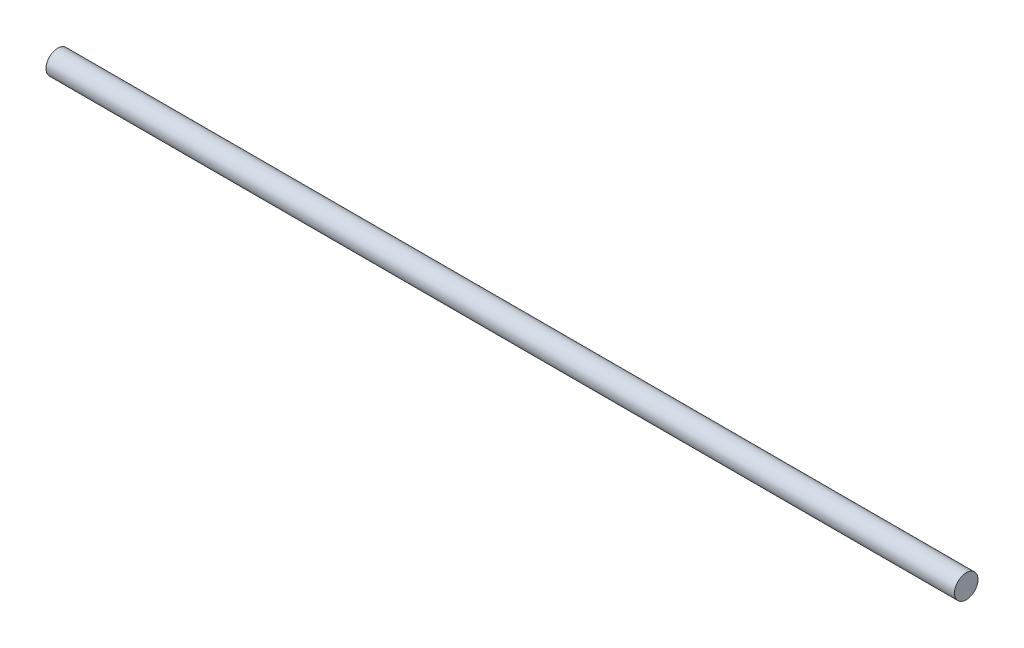
ISO-10303-21;
HEADER;
FILE_DESCRIPTION(('STEP AP214'),'2;1');
FILE_NAME('part.step','',(''),(''),'','','');
FILE_SCHEMA(('AUTOMOTIVE_DESIGN { 1 0 10303 214 1 1 1 1 }'));
ENDSEC;
DATA;
#1=APPLICATION_CONTEXT('core data for automotive mechanical design processes');
#2=APPLICATION_PROTOCOL_DEFINITION('international standard','automotive_design',2000,#1);
#3=PRODUCT_CONTEXT('',#1,'mechanical');
#4=PRODUCT('Part','Part','',(#3));
#5=PRODUCT_RELATED_PRODUCT_CATEGORY('part','',(#4));
#6=PRODUCT_DEFINITION_FORMATION('','',#4);
#7=PRODUCT_DEFINITION_CONTEXT('part definition',#1,'design');
#8=PRODUCT_DEFINITION('design','',#6,#7);
#9=PRODUCT_DEFINITION_SHAPE('','',#8);
#10=(LENGTH_UNIT() NAMED_UNIT(*) SI_UNIT(.MILLI.,.METRE.));
#11=(NAMED_UNIT(*) PLANE_ANGLE_UNIT() SI_UNIT($,.RADIAN.));
#12=(NAMED_UNIT(*) SI_UNIT($,.STERADIAN.) SOLID_ANGLE_UNIT());
#13=UNCERTAINTY_MEASURE_WITH_UNIT(LENGTH_MEASURE(1.E-05),#10,'distance_accuracy_value','');
#14=(GEOMETRIC_REPRESENTATION_CONTEXT(3) GLOBAL_UNCERTAINTY_ASSIGNED_CONTEXT((#13)) GLOBAL_UNIT_ASSIGNED_CONTEXT((#10,
#11,#12)) REPRESENTATION_CONTEXT('',''));
#15=CARTESIAN_POINT('',(0.,0.,0.));
#16=DIRECTION('',(0.,0.,1.));
#17=DIRECTION('',(1.,0.,0.));
#18=AXIS2_PLACEMENT_3D('',#15,#16,#17);
#19=CARTESIAN_POINT('',(-368.3,0.,0.));
#20=DIRECTION('',(1.,0.,0.));
#21=DIRECTION('',(0.,0.,-1.));
#22=AXIS2_PLACEMENT_3D('',#19,#20,#21);
#23=PLANE('',#22);
#24=CARTESIAN_POINT('',(-368.3,0.,0.));
#25=DIRECTION('',(1.,0.,0.));
#26=DIRECTION('',(0.,0.,-1.));
#27=AXIS2_PLACEMENT_3D('',#24,#25,#26);
#28=CIRCLE('',#27,9.525);
#29=CARTESIAN_POINT('',(-368.3,0.,-9.525));
#30=VERTEX_POINT('',#29);
#31=EDGE_CURVE('E34',#30,#30,#28,.T.);
#32=ORIENTED_EDGE('',*,*,#31,.F.);
#33=EDGE_LOOP('',(#32));
#34=FACE_BOUND('',#33,.T.);
#35=ADVANCED_FACE('F31',(#34),#23,.F.);
#36=CARTESIAN_POINT('',(368.3,0.,0.));
#37=DIRECTION('',(1.,0.,0.));
#38=DIRECTION('',(0.,0.,-1.));
#39=AXIS2_PLACEMENT_3D('',#36,#37,#38);
#40=PLANE('',#39);
#41=CARTESIAN_POINT('',(368.3,0.,0.));
#42=DIRECTION('',(1.,0.,0.));
#43=DIRECTION('',(0.,0.,-1.));
#44=AXIS2_PLACEMENT_3D('',#41,#42,#43);
#45=CIRCLE('',#44,9.525);
#46=CARTESIAN_POINT('',(368.3,0.,-9.525));
#47=VERTEX_POINT('',#46);
#48=EDGE_CURVE('E10',#47,#47,#45,.F.);
#49=ORIENTED_EDGE('',*,*,#48,.F.);
#50=EDGE_LOOP('',(#49));
#51=FACE_BOUND('',#50,.T.);
#52=ADVANCED_FACE('F46',(#51),#40,.T.);
#53=CARTESIAN_POINT('',(-368.3,0.,0.));
#54=DIRECTION('',(1.,0.,0.));
#55=DIRECTION('',(0.,0.,-1.));
#56=AXIS2_PLACEMENT_3D('',#53,#54,#55);
#57=CYLINDRICAL_SURFACE('',#56,9.525);
#58=ORIENTED_EDGE('',*,*,#48,.T.);
#59=EDGE_LOOP('',(#58));
#60=FACE_BOUND('',#59,.T.);
#61=ORIENTED_EDGE('',*,*,#31,.T.);
#62=EDGE_LOOP('',(#61));
#63=FACE_BOUND('',#62,.T.);
#64=ADVANCED_FACE('F43',(#60,#63),#57,.T.);
#65=CLOSED_SHELL('',(#35,#52,#64));
#66=MANIFOLD_SOLID_BREP('B2',#65);
#67=ADVANCED_BREP_SHAPE_REPRESENTATION('',(#18,#66),#14);
#68=SHAPE_DEFINITION_REPRESENTATION(#9,#67);
ENDSEC;
END-ISO-10303-21;
